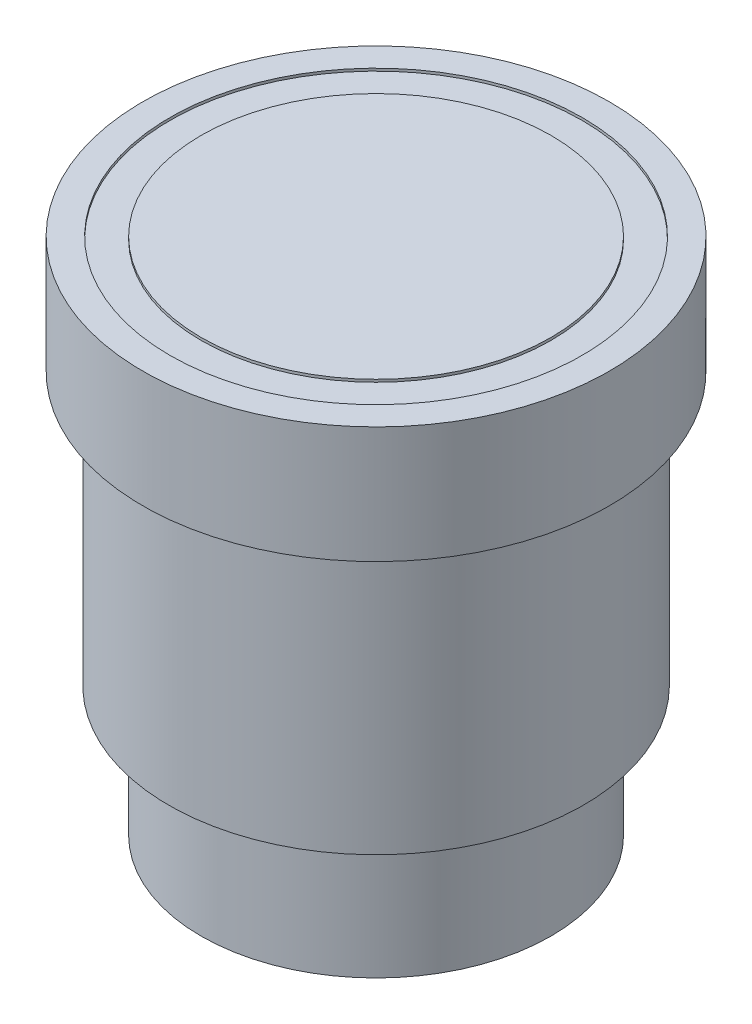
ISO-10303-21;
HEADER;
FILE_DESCRIPTION(('STEP AP214'),'2;1');
FILE_NAME('part.step','',(''),(''),'','','');
FILE_SCHEMA(('AUTOMOTIVE_DESIGN { 1 0 10303 214 1 1 1 1 }'));
ENDSEC;
DATA;
#1=APPLICATION_CONTEXT('core data for automotive mechanical design processes');
#2=APPLICATION_PROTOCOL_DEFINITION('international standard','automotive_design',2000,#1);
#3=PRODUCT_CONTEXT('',#1,'mechanical');
#4=PRODUCT('Part','Part','',(#3));
#5=PRODUCT_RELATED_PRODUCT_CATEGORY('part','',(#4));
#6=PRODUCT_DEFINITION_FORMATION('','',#4);
#7=PRODUCT_DEFINITION_CONTEXT('part definition',#1,'design');
#8=PRODUCT_DEFINITION('design','',#6,#7);
#9=PRODUCT_DEFINITION_SHAPE('','',#8);
#10=(LENGTH_UNIT() NAMED_UNIT(*) SI_UNIT(.MILLI.,.METRE.));
#11=(NAMED_UNIT(*) PLANE_ANGLE_UNIT() SI_UNIT($,.RADIAN.));
#12=(NAMED_UNIT(*) SI_UNIT($,.STERADIAN.) SOLID_ANGLE_UNIT());
#13=UNCERTAINTY_MEASURE_WITH_UNIT(LENGTH_MEASURE(1.E-05),#10,'distance_accuracy_value','');
#14=(GEOMETRIC_REPRESENTATION_CONTEXT(3) GLOBAL_UNCERTAINTY_ASSIGNED_CONTEXT((#13)) GLOBAL_UNIT_ASSIGNED_CONTEXT((#10,
#11,#12)) REPRESENTATION_CONTEXT('',''));
#15=CARTESIAN_POINT('',(0.,0.,0.));
#16=DIRECTION('',(0.,0.,1.));
#17=DIRECTION('',(1.,0.,0.));
#18=AXIS2_PLACEMENT_3D('',#15,#16,#17);
#19=CARTESIAN_POINT('',(0.,20.,0.));
#20=DIRECTION('',(0.,1.,0.));
#21=DIRECTION('',(0.,0.,1.));
#22=AXIS2_PLACEMENT_3D('',#19,#20,#21);
#23=PLANE('',#22);
#24=CARTESIAN_POINT('',(0.,20.,0.));
#25=DIRECTION('',(0.,1.,0.));
#26=DIRECTION('',(0.,0.,1.));
#27=AXIS2_PLACEMENT_3D('',#24,#25,#26);
#28=CIRCLE('',#27,7.95);
#29=CARTESIAN_POINT('',(0.,20.,7.95));
#30=VERTEX_POINT('',#29);
#31=EDGE_CURVE('E62',#30,#30,#28,.T.);
#32=ORIENTED_EDGE('',*,*,#31,.F.);
#33=EDGE_LOOP('',(#32));
#34=FACE_BOUND('',#33,.T.);
#35=CARTESIAN_POINT('',(0.,20.,0.));
#36=DIRECTION('',(0.,-1.,0.));
#37=DIRECTION('',(0.,0.,-1.));
#38=AXIS2_PLACEMENT_3D('',#35,#36,#37);
#39=CIRCLE('',#38,9.);
#40=CARTESIAN_POINT('',(0.,20.,-9.));
#41=VERTEX_POINT('',#40);
#42=EDGE_CURVE('E10',#41,#41,#39,.T.);
#43=ORIENTED_EDGE('',*,*,#42,.F.);
#44=EDGE_LOOP('',(#43));
#45=FACE_BOUND('',#44,.T.);
#46=ADVANCED_FACE('F36',(#34,#45),#23,.T.);
#47=CARTESIAN_POINT('',(0.,0.,0.));
#48=DIRECTION('',(0.,-1.,0.));
#49=DIRECTION('',(0.,0.,-1.));
#50=AXIS2_PLACEMENT_3D('',#47,#48,#49);
#51=CYLINDRICAL_SURFACE('',#50,9.);
#52=ORIENTED_EDGE('',*,*,#42,.T.);
#53=EDGE_LOOP('',(#52));
#54=FACE_BOUND('',#53,.T.);
#55=CARTESIAN_POINT('',(0.,15.5,0.));
#56=DIRECTION('',(0.,-1.,0.));
#57=DIRECTION('',(0.,0.,-1.));
#58=AXIS2_PLACEMENT_3D('',#55,#56,#57);
#59=CIRCLE('',#58,9.);
#60=CARTESIAN_POINT('',(0.,15.5,-9.));
#61=VERTEX_POINT('',#60);
#62=EDGE_CURVE('E42',#61,#61,#59,.T.);
#63=ORIENTED_EDGE('',*,*,#62,.F.);
#64=EDGE_LOOP('',(#63));
#65=FACE_BOUND('',#64,.T.);
#66=ADVANCED_FACE('F92',(#54,#65),#51,.T.);
#67=CARTESIAN_POINT('',(0.,15.5,-9.));
#68=DIRECTION('',(0.,-1.,0.));
#69=DIRECTION('',(0.,0.,-1.));
#70=AXIS2_PLACEMENT_3D('',#67,#68,#69);
#71=PLANE('',#70);
#72=ORIENTED_EDGE('',*,*,#62,.T.);
#73=EDGE_LOOP('',(#72));
#74=FACE_BOUND('',#73,.T.);
#75=CARTESIAN_POINT('',(0.,15.5,0.));
#76=DIRECTION('',(0.,-1.,0.));
#77=DIRECTION('',(0.,0.,-1.));
#78=AXIS2_PLACEMENT_3D('',#75,#76,#77);
#79=CIRCLE('',#78,8.);
#80=CARTESIAN_POINT('',(0.,15.5,-8.));
#81=VERTEX_POINT('',#80);
#82=EDGE_CURVE('E46',#81,#81,#79,.T.);
#83=ORIENTED_EDGE('',*,*,#82,.F.);
#84=EDGE_LOOP('',(#83));
#85=FACE_BOUND('',#84,.T.);
#86=ADVANCED_FACE('F97',(#74,#85),#71,.T.);
#87=CARTESIAN_POINT('',(0.,0.,0.));
#88=DIRECTION('',(0.,-1.,0.));
#89=DIRECTION('',(0.,0.,-1.));
#90=AXIS2_PLACEMENT_3D('',#87,#88,#89);
#91=CYLINDRICAL_SURFACE('',#90,8.);
#92=ORIENTED_EDGE('',*,*,#82,.T.);
#93=EDGE_LOOP('',(#92));
#94=FACE_BOUND('',#93,.T.);
#95=CARTESIAN_POINT('',(0.,5.,0.));
#96=DIRECTION('',(0.,-1.,0.));
#97=DIRECTION('',(0.,0.,-1.));
#98=AXIS2_PLACEMENT_3D('',#95,#96,#97);
#99=CIRCLE('',#98,8.);
#100=CARTESIAN_POINT('',(0.,5.,-8.));
#101=VERTEX_POINT('',#100);
#102=EDGE_CURVE('E50',#101,#101,#99,.T.);
#103=ORIENTED_EDGE('',*,*,#102,.F.);
#104=EDGE_LOOP('',(#103));
#105=FACE_BOUND('',#104,.T.);
#106=ADVANCED_FACE('F118',(#94,#105),#91,.T.);
#107=CARTESIAN_POINT('',(0.,5.,-8.));
#108=DIRECTION('',(0.,-1.,0.));
#109=DIRECTION('',(0.,0.,-1.));
#110=AXIS2_PLACEMENT_3D('',#107,#108,#109);
#111=PLANE('',#110);
#112=ORIENTED_EDGE('',*,*,#102,.T.);
#113=EDGE_LOOP('',(#112));
#114=FACE_BOUND('',#113,.T.);
#115=CARTESIAN_POINT('',(0.,5.,0.));
#116=DIRECTION('',(0.,-1.,0.));
#117=DIRECTION('',(0.,0.,-1.));
#118=AXIS2_PLACEMENT_3D('',#115,#116,#117);
#119=CIRCLE('',#118,6.75);
#120=CARTESIAN_POINT('',(0.,5.,-6.75));
#121=VERTEX_POINT('',#120);
#122=EDGE_CURVE('E55',#121,#121,#119,.T.);
#123=ORIENTED_EDGE('',*,*,#122,.F.);
#124=EDGE_LOOP('',(#123));
#125=FACE_BOUND('',#124,.T.);
#126=ADVANCED_FACE('F114',(#114,#125),#111,.T.);
#127=CARTESIAN_POINT('',(0.,0.,0.));
#128=DIRECTION('',(0.,-1.,0.));
#129=DIRECTION('',(0.,0.,-1.));
#130=AXIS2_PLACEMENT_3D('',#127,#128,#129);
#131=CYLINDRICAL_SURFACE('',#130,6.75);
#132=ORIENTED_EDGE('',*,*,#122,.T.);
#133=EDGE_LOOP('',(#132));
#134=FACE_BOUND('',#133,.T.);
#135=CARTESIAN_POINT('',(0.,0.,0.));
#136=DIRECTION('',(0.,-1.,0.));
#137=DIRECTION('',(0.,0.,-1.));
#138=AXIS2_PLACEMENT_3D('',#135,#136,#137);
#139=CIRCLE('',#138,6.75);
#140=CARTESIAN_POINT('',(0.,0.,-6.75));
#141=VERTEX_POINT('',#140);
#142=EDGE_CURVE('E58',#141,#141,#139,.T.);
#143=ORIENTED_EDGE('',*,*,#142,.F.);
#144=EDGE_LOOP('',(#143));
#145=FACE_BOUND('',#144,.T.);
#146=ADVANCED_FACE('F110',(#134,#145),#131,.T.);
#147=CARTESIAN_POINT('',(0.,0.,-6.75));
#148=DIRECTION('',(0.,-1.,0.));
#149=DIRECTION('',(0.,0.,-1.));
#150=AXIS2_PLACEMENT_3D('',#147,#148,#149);
#151=PLANE('',#150);
#152=ORIENTED_EDGE('',*,*,#142,.T.);
#153=EDGE_LOOP('',(#152));
#154=FACE_BOUND('',#153,.T.);
#155=ADVANCED_FACE('F86',(#154),#151,.T.);
#156=CARTESIAN_POINT('',(0.,19.9,0.));
#157=DIRECTION('',(0.,1.,0.));
#158=DIRECTION('',(0.,0.,1.));
#159=AXIS2_PLACEMENT_3D('',#156,#157,#158);
#160=CYLINDRICAL_SURFACE('',#159,7.95);
#161=CARTESIAN_POINT('',(0.,19.9,0.));
#162=DIRECTION('',(0.,1.,0.));
#163=DIRECTION('',(0.,0.,1.));
#164=AXIS2_PLACEMENT_3D('',#161,#162,#163);
#165=CIRCLE('',#164,7.95);
#166=CARTESIAN_POINT('',(0.,19.9,7.95));
#167=VERTEX_POINT('',#166);
#168=EDGE_CURVE('E61',#167,#167,#165,.T.);
#169=ORIENTED_EDGE('',*,*,#168,.F.);
#170=EDGE_LOOP('',(#169));
#171=FACE_BOUND('',#170,.T.);
#172=ORIENTED_EDGE('',*,*,#31,.T.);
#173=EDGE_LOOP('',(#172));
#174=FACE_BOUND('',#173,.T.);
#175=ADVANCED_FACE('F80',(#171,#174),#160,.F.);
#176=CARTESIAN_POINT('',(0.,19.9,0.));
#177=DIRECTION('',(0.,1.,0.));
#178=DIRECTION('',(0.,0.,1.));
#179=AXIS2_PLACEMENT_3D('',#176,#177,#178);
#180=PLANE('',#179);
#181=CARTESIAN_POINT('',(0.,19.9,0.));
#182=DIRECTION('',(0.,1.,0.));
#183=DIRECTION('',(0.,0.,1.));
#184=AXIS2_PLACEMENT_3D('',#181,#182,#183);
#185=CIRCLE('',#184,6.75);
#186=CARTESIAN_POINT('',(0.,19.9,6.75));
#187=VERTEX_POINT('',#186);
#188=EDGE_CURVE('E65',#187,#187,#185,.T.);
#189=ORIENTED_EDGE('',*,*,#188,.F.);
#190=EDGE_LOOP('',(#189));
#191=FACE_BOUND('',#190,.T.);
#192=ORIENTED_EDGE('',*,*,#168,.T.);
#193=EDGE_LOOP('',(#192));
#194=FACE_BOUND('',#193,.T.);
#195=ADVANCED_FACE('F77',(#191,#194),#180,.T.);
#196=CARTESIAN_POINT('',(0.,19.9,0.));
#197=DIRECTION('',(0.,1.,0.));
#198=DIRECTION('',(0.,0.,1.));
#199=AXIS2_PLACEMENT_3D('',#196,#197,#198);
#200=CYLINDRICAL_SURFACE('',#199,6.75);
#201=ORIENTED_EDGE('',*,*,#188,.T.);
#202=EDGE_LOOP('',(#201));
#203=FACE_BOUND('',#202,.T.);
#204=CARTESIAN_POINT('',(0.,20.,0.));
#205=DIRECTION('',(0.,1.,0.));
#206=DIRECTION('',(0.,0.,1.));
#207=AXIS2_PLACEMENT_3D('',#204,#205,#206);
#208=CIRCLE('',#207,6.75);
#209=CARTESIAN_POINT('',(0.,20.,6.75));
#210=VERTEX_POINT('',#209);
#211=EDGE_CURVE('E68',#210,#210,#208,.T.);
#212=ORIENTED_EDGE('',*,*,#211,.F.);
#213=EDGE_LOOP('',(#212));
#214=FACE_BOUND('',#213,.T.);
#215=ADVANCED_FACE('F74',(#203,#214),#200,.T.);
#216=ORIENTED_EDGE('',*,*,#211,.T.);
#217=EDGE_LOOP('',(#216));
#218=FACE_BOUND('',#217,.T.);
#219=ADVANCED_FACE('F93',(#218),#23,.T.);
#220=CLOSED_SHELL('',(#46,#66,#86,#106,#126,#146,#155,#175,#195,#215,#219));
#221=MANIFOLD_SOLID_BREP('B2',#220);
#222=ADVANCED_BREP_SHAPE_REPRESENTATION('',(#18,#221),#14);
#223=SHAPE_DEFINITION_REPRESENTATION(#9,#222);
ENDSEC;
END-ISO-10303-21;
